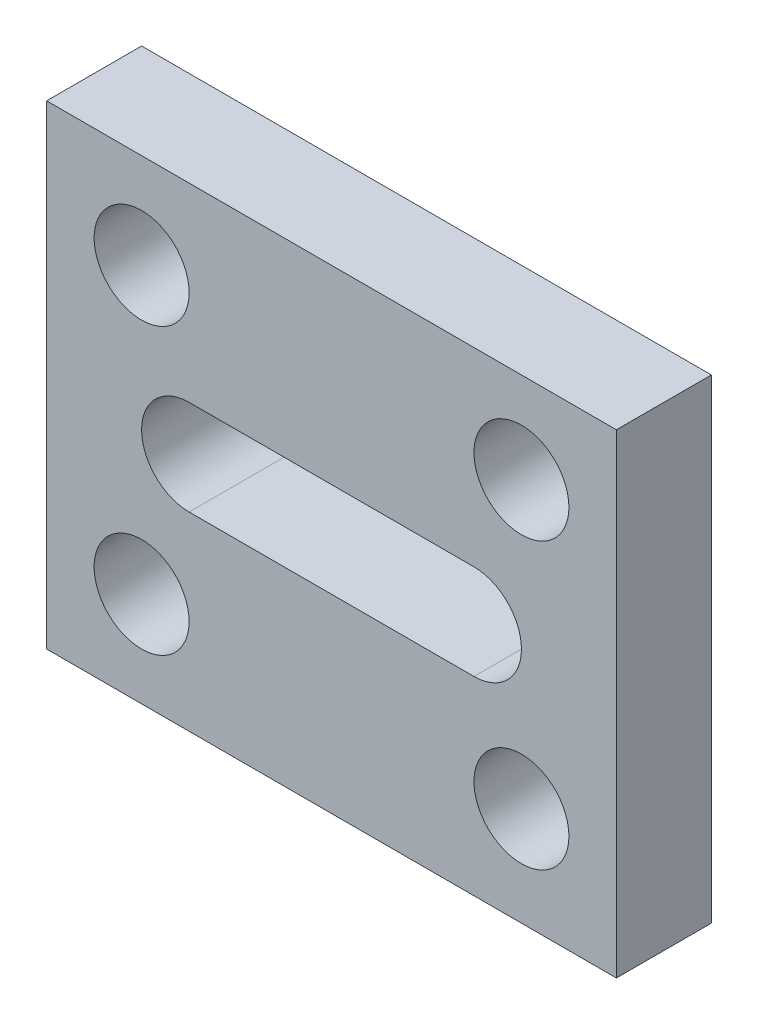
ISO-10303-21;
HEADER;
FILE_DESCRIPTION(('STEP AP214'),'2;1');
FILE_NAME('part.step','',(''),(''),'','','');
FILE_SCHEMA(('AUTOMOTIVE_DESIGN { 1 0 10303 214 1 1 1 1 }'));
ENDSEC;
DATA;
#1=APPLICATION_CONTEXT('core data for automotive mechanical design processes');
#2=APPLICATION_PROTOCOL_DEFINITION('international standard','automotive_design',2000,#1);
#3=PRODUCT_CONTEXT('',#1,'mechanical');
#4=PRODUCT('Part','Part','',(#3));
#5=PRODUCT_RELATED_PRODUCT_CATEGORY('part','',(#4));
#6=PRODUCT_DEFINITION_FORMATION('','',#4);
#7=PRODUCT_DEFINITION_CONTEXT('part definition',#1,'design');
#8=PRODUCT_DEFINITION('design','',#6,#7);
#9=PRODUCT_DEFINITION_SHAPE('','',#8);
#10=(LENGTH_UNIT() NAMED_UNIT(*) SI_UNIT(.MILLI.,.METRE.));
#11=(NAMED_UNIT(*) PLANE_ANGLE_UNIT() SI_UNIT($,.RADIAN.));
#12=(NAMED_UNIT(*) SI_UNIT($,.STERADIAN.) SOLID_ANGLE_UNIT());
#13=UNCERTAINTY_MEASURE_WITH_UNIT(LENGTH_MEASURE(1.E-05),#10,'distance_accuracy_value','');
#14=(GEOMETRIC_REPRESENTATION_CONTEXT(3) GLOBAL_UNCERTAINTY_ASSIGNED_CONTEXT((#13)) GLOBAL_UNIT_ASSIGNED_CONTEXT((#10,
#11,#12)) REPRESENTATION_CONTEXT('',''));
#15=CARTESIAN_POINT('',(0.,0.,0.));
#16=DIRECTION('',(0.,0.,1.));
#17=DIRECTION('',(1.,0.,0.));
#18=AXIS2_PLACEMENT_3D('',#15,#16,#17);
#19=CARTESIAN_POINT('',(0.,0.,20.));
#20=DIRECTION('',(0.,0.,1.));
#21=DIRECTION('',(1.,0.,0.));
#22=AXIS2_PLACEMENT_3D('',#19,#20,#21);
#23=PLANE('',#22);
#24=CARTESIAN_POINT('',(40.,30.8502817083049,20.));
#25=DIRECTION('',(0.,0.,1.));
#26=DIRECTION('',(1.,0.,0.));
#27=AXIS2_PLACEMENT_3D('',#24,#25,#26);
#28=CIRCLE('',#27,10.);
#29=CARTESIAN_POINT('',(50.,30.8502817083049,20.));
#30=VERTEX_POINT('',#29);
#31=EDGE_CURVE('E245',#30,#30,#28,.T.);
#32=ORIENTED_EDGE('',*,*,#31,.F.);
#33=EDGE_LOOP('',(#32));
#34=FACE_BOUND('',#33,.T.);
#35=CARTESIAN_POINT('',(-40.,-30.,20.));
#36=DIRECTION('',(0.,0.,1.));
#37=DIRECTION('',(1.,0.,0.));
#38=AXIS2_PLACEMENT_3D('',#35,#36,#37);
#39=CIRCLE('',#38,10.);
#40=CARTESIAN_POINT('',(-30.,-30.,20.));
#41=VERTEX_POINT('',#40);
#42=EDGE_CURVE('E127',#41,#41,#39,.T.);
#43=ORIENTED_EDGE('',*,*,#42,.F.);
#44=EDGE_LOOP('',(#43));
#45=FACE_BOUND('',#44,.T.);
#46=DIRECTION('',(0.,-1.,0.));
#47=VECTOR('',#46,1.);
#48=CARTESIAN_POINT('',(-60.,-50.,20.));
#49=LINE('',#48,#47);
#50=CARTESIAN_POINT('',(-60.,50.,20.));
#51=VERTEX_POINT('',#50);
#52=CARTESIAN_POINT('',(-60.,-50.,20.));
#53=VERTEX_POINT('',#52);
#54=EDGE_CURVE('E137',#51,#53,#49,.T.);
#55=ORIENTED_EDGE('',*,*,#54,.T.);
#56=DIRECTION('',(1.,0.,0.));
#57=VECTOR('',#56,1.);
#58=CARTESIAN_POINT('',(60.,-50.,20.));
#59=LINE('',#58,#57);
#60=CARTESIAN_POINT('',(60.,-50.,20.));
#61=VERTEX_POINT('',#60);
#62=EDGE_CURVE('E140',#53,#61,#59,.T.);
#63=ORIENTED_EDGE('',*,*,#62,.T.);
#64=DIRECTION('',(0.,1.,0.));
#65=VECTOR('',#64,1.);
#66=CARTESIAN_POINT('',(60.,-50.,20.));
#67=LINE('',#66,#65);
#68=CARTESIAN_POINT('',(60.,50.,20.));
#69=VERTEX_POINT('',#68);
#70=EDGE_CURVE('E143',#61,#69,#67,.T.);
#71=ORIENTED_EDGE('',*,*,#70,.T.);
#72=DIRECTION('',(-1.,0.,0.));
#73=VECTOR('',#72,1.);
#74=CARTESIAN_POINT('',(60.,50.,20.));
#75=LINE('',#74,#73);
#76=EDGE_CURVE('E145',#69,#51,#75,.T.);
#77=ORIENTED_EDGE('',*,*,#76,.T.);
#78=EDGE_LOOP('',(#55,#63,#71,#77));
#79=FACE_BOUND('',#78,.T.);
#80=DIRECTION('',(1.,0.,0.));
#81=VECTOR('',#80,1.);
#82=CARTESIAN_POINT('',(30.,-10.,20.));
#83=LINE('',#82,#81);
#84=CARTESIAN_POINT('',(-30.,-10.,20.));
#85=VERTEX_POINT('',#84);
#86=CARTESIAN_POINT('',(30.,-10.,20.));
#87=VERTEX_POINT('',#86);
#88=EDGE_CURVE('E106',#85,#87,#83,.T.);
#89=ORIENTED_EDGE('',*,*,#88,.F.);
#90=CARTESIAN_POINT('',(-30.,0.,20.));
#91=DIRECTION('',(0.,0.,1.));
#92=DIRECTION('',(1.,0.,0.));
#93=AXIS2_PLACEMENT_3D('',#90,#91,#92);
#94=CIRCLE('',#93,10.);
#95=CARTESIAN_POINT('',(-30.,9.99999999999999,20.));
#96=VERTEX_POINT('',#95);
#97=EDGE_CURVE('E98',#96,#85,#94,.T.);
#98=ORIENTED_EDGE('',*,*,#97,.F.);
#99=DIRECTION('',(-1.,0.,0.));
#100=VECTOR('',#99,1.);
#101=CARTESIAN_POINT('',(29.9999999999999,10.,20.));
#102=LINE('',#101,#100);
#103=CARTESIAN_POINT('',(30.,10.,20.));
#104=VERTEX_POINT('',#103);
#105=EDGE_CURVE('E121',#104,#96,#102,.T.);
#106=ORIENTED_EDGE('',*,*,#105,.F.);
#107=CARTESIAN_POINT('',(30.,0.,20.));
#108=DIRECTION('',(0.,0.,1.));
#109=DIRECTION('',(1.,0.,0.));
#110=AXIS2_PLACEMENT_3D('',#107,#108,#109);
#111=CIRCLE('',#110,10.);
#112=EDGE_CURVE('E119',#87,#104,#111,.T.);
#113=ORIENTED_EDGE('',*,*,#112,.F.);
#114=EDGE_LOOP('',(#89,#98,#106,#113));
#115=FACE_BOUND('',#114,.T.);
#116=CARTESIAN_POINT('',(-40.,30.,20.));
#117=DIRECTION('',(0.,0.,1.));
#118=DIRECTION('',(1.,0.,0.));
#119=AXIS2_PLACEMENT_3D('',#116,#117,#118);
#120=CIRCLE('',#119,10.);
#121=CARTESIAN_POINT('',(-30.,30.,20.));
#122=VERTEX_POINT('',#121);
#123=EDGE_CURVE('E251',#122,#122,#120,.T.);
#124=ORIENTED_EDGE('',*,*,#123,.F.);
#125=EDGE_LOOP('',(#124));
#126=FACE_BOUND('',#125,.T.);
#127=CARTESIAN_POINT('',(40.,-29.1497182916951,20.));
#128=DIRECTION('',(0.,0.,1.));
#129=DIRECTION('',(1.,0.,0.));
#130=AXIS2_PLACEMENT_3D('',#127,#128,#129);
#131=CIRCLE('',#130,10.);
#132=CARTESIAN_POINT('',(50.,-29.1497182916951,20.));
#133=VERTEX_POINT('',#132);
#134=EDGE_CURVE('E236',#133,#133,#131,.T.);
#135=ORIENTED_EDGE('',*,*,#134,.F.);
#136=EDGE_LOOP('',(#135));
#137=FACE_BOUND('',#136,.T.);
#138=ADVANCED_FACE('F33',(#34,#45,#79,#115,#126,#137),#23,.T.);
#139=CARTESIAN_POINT('',(0.,0.,0.));
#140=DIRECTION('',(0.,0.,1.));
#141=DIRECTION('',(1.,0.,0.));
#142=AXIS2_PLACEMENT_3D('',#139,#140,#141);
#143=PLANE('',#142);
#144=DIRECTION('',(0.,-1.,0.));
#145=VECTOR('',#144,1.);
#146=CARTESIAN_POINT('',(-60.,-50.,0.));
#147=LINE('',#146,#145);
#148=CARTESIAN_POINT('',(-60.,50.,0.));
#149=VERTEX_POINT('',#148);
#150=CARTESIAN_POINT('',(-60.,-50.,0.));
#151=VERTEX_POINT('',#150);
#152=EDGE_CURVE('E114',#149,#151,#147,.T.);
#153=ORIENTED_EDGE('',*,*,#152,.F.);
#154=DIRECTION('',(-1.,0.,0.));
#155=VECTOR('',#154,1.);
#156=CARTESIAN_POINT('',(60.,50.,0.));
#157=LINE('',#156,#155);
#158=CARTESIAN_POINT('',(60.,50.,0.));
#159=VERTEX_POINT('',#158);
#160=EDGE_CURVE('E141',#159,#149,#157,.T.);
#161=ORIENTED_EDGE('',*,*,#160,.F.);
#162=DIRECTION('',(0.,1.,0.));
#163=VECTOR('',#162,1.);
#164=CARTESIAN_POINT('',(60.,-50.,0.));
#165=LINE('',#164,#163);
#166=CARTESIAN_POINT('',(60.,-50.,0.));
#167=VERTEX_POINT('',#166);
#168=EDGE_CURVE('E152',#167,#159,#165,.T.);
#169=ORIENTED_EDGE('',*,*,#168,.F.);
#170=DIRECTION('',(1.,0.,0.));
#171=VECTOR('',#170,1.);
#172=CARTESIAN_POINT('',(60.,-50.,0.));
#173=LINE('',#172,#171);
#174=EDGE_CURVE('E150',#151,#167,#173,.T.);
#175=ORIENTED_EDGE('',*,*,#174,.F.);
#176=EDGE_LOOP('',(#153,#161,#169,#175));
#177=FACE_BOUND('',#176,.T.);
#178=CARTESIAN_POINT('',(-30.,0.,0.));
#179=DIRECTION('',(0.,0.,1.));
#180=DIRECTION('',(1.,0.,0.));
#181=AXIS2_PLACEMENT_3D('',#178,#179,#180);
#182=CIRCLE('',#181,10.);
#183=CARTESIAN_POINT('',(-30.,9.99999999999999,0.));
#184=VERTEX_POINT('',#183);
#185=CARTESIAN_POINT('',(-30.,-10.,0.));
#186=VERTEX_POINT('',#185);
#187=EDGE_CURVE('E56',#184,#186,#182,.T.);
#188=ORIENTED_EDGE('',*,*,#187,.T.);
#189=DIRECTION('',(1.,0.,0.));
#190=VECTOR('',#189,1.);
#191=CARTESIAN_POINT('',(30.,-10.,0.));
#192=LINE('',#191,#190);
#193=CARTESIAN_POINT('',(30.,-10.,0.));
#194=VERTEX_POINT('',#193);
#195=EDGE_CURVE('E113',#186,#194,#192,.T.);
#196=ORIENTED_EDGE('',*,*,#195,.T.);
#197=CARTESIAN_POINT('',(30.,0.,0.));
#198=DIRECTION('',(0.,0.,1.));
#199=DIRECTION('',(1.,0.,0.));
#200=AXIS2_PLACEMENT_3D('',#197,#198,#199);
#201=CIRCLE('',#200,10.);
#202=CARTESIAN_POINT('',(29.9999999999999,10.,0.));
#203=VERTEX_POINT('',#202);
#204=EDGE_CURVE('E129',#194,#203,#201,.T.);
#205=ORIENTED_EDGE('',*,*,#204,.T.);
#206=DIRECTION('',(-1.,0.,0.));
#207=VECTOR('',#206,1.);
#208=CARTESIAN_POINT('',(29.9999999999999,10.,0.));
#209=LINE('',#208,#207);
#210=EDGE_CURVE('E107',#203,#184,#209,.T.);
#211=ORIENTED_EDGE('',*,*,#210,.T.);
#212=EDGE_LOOP('',(#188,#196,#205,#211));
#213=FACE_BOUND('',#212,.T.);
#214=CARTESIAN_POINT('',(-40.,-30.,0.));
#215=DIRECTION('',(0.,0.,1.));
#216=DIRECTION('',(1.,0.,0.));
#217=AXIS2_PLACEMENT_3D('',#214,#215,#216);
#218=CIRCLE('',#217,10.);
#219=CARTESIAN_POINT('',(-30.,-30.,0.));
#220=VERTEX_POINT('',#219);
#221=EDGE_CURVE('E254',#220,#220,#218,.T.);
#222=ORIENTED_EDGE('',*,*,#221,.T.);
#223=EDGE_LOOP('',(#222));
#224=FACE_BOUND('',#223,.T.);
#225=CARTESIAN_POINT('',(-40.,30.,0.));
#226=DIRECTION('',(0.,0.,1.));
#227=DIRECTION('',(1.,0.,0.));
#228=AXIS2_PLACEMENT_3D('',#225,#226,#227);
#229=CIRCLE('',#228,10.);
#230=CARTESIAN_POINT('',(-30.,30.,0.));
#231=VERTEX_POINT('',#230);
#232=EDGE_CURVE('E248',#231,#231,#229,.T.);
#233=ORIENTED_EDGE('',*,*,#232,.T.);
#234=EDGE_LOOP('',(#233));
#235=FACE_BOUND('',#234,.T.);
#236=CARTESIAN_POINT('',(40.,30.8502817083049,0.));
#237=DIRECTION('',(0.,0.,1.));
#238=DIRECTION('',(1.,0.,0.));
#239=AXIS2_PLACEMENT_3D('',#236,#237,#238);
#240=CIRCLE('',#239,10.);
#241=CARTESIAN_POINT('',(50.,30.8502817083049,0.));
#242=VERTEX_POINT('',#241);
#243=EDGE_CURVE('E242',#242,#242,#240,.T.);
#244=ORIENTED_EDGE('',*,*,#243,.T.);
#245=EDGE_LOOP('',(#244));
#246=FACE_BOUND('',#245,.T.);
#247=CARTESIAN_POINT('',(40.,-29.1497182916951,0.));
#248=DIRECTION('',(0.,0.,1.));
#249=DIRECTION('',(1.,0.,0.));
#250=AXIS2_PLACEMENT_3D('',#247,#248,#249);
#251=CIRCLE('',#250,10.);
#252=CARTESIAN_POINT('',(50.,-29.1497182916951,0.));
#253=VERTEX_POINT('',#252);
#254=EDGE_CURVE('E239',#253,#253,#251,.T.);
#255=ORIENTED_EDGE('',*,*,#254,.T.);
#256=EDGE_LOOP('',(#255));
#257=FACE_BOUND('',#256,.T.);
#258=ADVANCED_FACE('F170',(#177,#213,#224,#235,#246,#257),#143,.F.);
#259=CARTESIAN_POINT('',(-60.,-50.,20.));
#260=DIRECTION('',(1.,0.,0.));
#261=DIRECTION('',(0.,0.,-1.));
#262=AXIS2_PLACEMENT_3D('',#259,#260,#261);
#263=PLANE('',#262);
#264=ORIENTED_EDGE('',*,*,#152,.T.);
#265=DIRECTION('',(0.,0.,-1.));
#266=VECTOR('',#265,1.);
#267=CARTESIAN_POINT('',(-60.,-50.,20.));
#268=LINE('',#267,#266);
#269=EDGE_CURVE('E11',#53,#151,#268,.T.);
#270=ORIENTED_EDGE('',*,*,#269,.F.);
#271=ORIENTED_EDGE('',*,*,#54,.F.);
#272=DIRECTION('',(0.,0.,-1.));
#273=VECTOR('',#272,1.);
#274=CARTESIAN_POINT('',(-60.,50.,20.));
#275=LINE('',#274,#273);
#276=EDGE_CURVE('E147',#51,#149,#275,.T.);
#277=ORIENTED_EDGE('',*,*,#276,.T.);
#278=EDGE_LOOP('',(#264,#270,#271,#277));
#279=FACE_BOUND('',#278,.T.);
#280=ADVANCED_FACE('F35',(#279),#263,.F.);
#281=CARTESIAN_POINT('',(60.,-50.,20.));
#282=DIRECTION('',(0.,1.,0.));
#283=DIRECTION('',(-1.,0.,0.));
#284=AXIS2_PLACEMENT_3D('',#281,#282,#283);
#285=PLANE('',#284);
#286=ORIENTED_EDGE('',*,*,#174,.T.);
#287=DIRECTION('',(0.,0.,-1.));
#288=VECTOR('',#287,1.);
#289=CARTESIAN_POINT('',(60.,-50.,20.));
#290=LINE('',#289,#288);
#291=EDGE_CURVE('E41',#61,#167,#290,.T.);
#292=ORIENTED_EDGE('',*,*,#291,.F.);
#293=ORIENTED_EDGE('',*,*,#62,.F.);
#294=ORIENTED_EDGE('',*,*,#269,.T.);
#295=EDGE_LOOP('',(#286,#292,#293,#294));
#296=FACE_BOUND('',#295,.T.);
#297=ADVANCED_FACE('F180',(#296),#285,.F.);
#298=CARTESIAN_POINT('',(60.,-50.,20.));
#299=DIRECTION('',(-1.,0.,0.));
#300=DIRECTION('',(0.,0.,1.));
#301=AXIS2_PLACEMENT_3D('',#298,#299,#300);
#302=PLANE('',#301);
#303=ORIENTED_EDGE('',*,*,#168,.T.);
#304=DIRECTION('',(0.,0.,-1.));
#305=VECTOR('',#304,1.);
#306=CARTESIAN_POINT('',(60.,50.,20.));
#307=LINE('',#306,#305);
#308=EDGE_CURVE('E157',#69,#159,#307,.T.);
#309=ORIENTED_EDGE('',*,*,#308,.F.);
#310=ORIENTED_EDGE('',*,*,#70,.F.);
#311=ORIENTED_EDGE('',*,*,#291,.T.);
#312=EDGE_LOOP('',(#303,#309,#310,#311));
#313=FACE_BOUND('',#312,.T.);
#314=ADVANCED_FACE('F164',(#313),#302,.F.);
#315=CARTESIAN_POINT('',(60.,50.,20.));
#316=DIRECTION('',(0.,-1.,0.));
#317=DIRECTION('',(1.,0.,0.));
#318=AXIS2_PLACEMENT_3D('',#315,#316,#317);
#319=PLANE('',#318);
#320=ORIENTED_EDGE('',*,*,#160,.T.);
#321=ORIENTED_EDGE('',*,*,#276,.F.);
#322=ORIENTED_EDGE('',*,*,#76,.F.);
#323=ORIENTED_EDGE('',*,*,#308,.T.);
#324=EDGE_LOOP('',(#320,#321,#322,#323));
#325=FACE_BOUND('',#324,.T.);
#326=ADVANCED_FACE('F174',(#325),#319,.F.);
#327=CARTESIAN_POINT('',(-30.,0.,20.));
#328=DIRECTION('',(0.,0.,-1.));
#329=DIRECTION('',(-1.,0.,0.));
#330=AXIS2_PLACEMENT_3D('',#327,#328,#329);
#331=CYLINDRICAL_SURFACE('',#330,10.);
#332=ORIENTED_EDGE('',*,*,#187,.F.);
#333=DIRECTION('',(0.,0.,-1.));
#334=VECTOR('',#333,1.);
#335=CARTESIAN_POINT('',(-30.,9.99999999999999,20.));
#336=LINE('',#335,#334);
#337=EDGE_CURVE('E102',#96,#184,#336,.T.);
#338=ORIENTED_EDGE('',*,*,#337,.F.);
#339=ORIENTED_EDGE('',*,*,#97,.T.);
#340=DIRECTION('',(0.,0.,-1.));
#341=VECTOR('',#340,1.);
#342=CARTESIAN_POINT('',(-30.,-10.,20.));
#343=LINE('',#342,#341);
#344=EDGE_CURVE('E101',#85,#186,#343,.T.);
#345=ORIENTED_EDGE('',*,*,#344,.T.);
#346=EDGE_LOOP('',(#332,#338,#339,#345));
#347=FACE_BOUND('',#346,.T.);
#348=ADVANCED_FACE('F100',(#347),#331,.F.);
#349=CARTESIAN_POINT('',(30.,-10.,20.));
#350=DIRECTION('',(0.,1.,0.));
#351=DIRECTION('',(-1.,0.,0.));
#352=AXIS2_PLACEMENT_3D('',#349,#350,#351);
#353=PLANE('',#352);
#354=ORIENTED_EDGE('',*,*,#195,.F.);
#355=ORIENTED_EDGE('',*,*,#344,.F.);
#356=ORIENTED_EDGE('',*,*,#88,.T.);
#357=DIRECTION('',(0.,0.,-1.));
#358=VECTOR('',#357,1.);
#359=CARTESIAN_POINT('',(30.,-10.,20.));
#360=LINE('',#359,#358);
#361=EDGE_CURVE('E115',#87,#194,#360,.T.);
#362=ORIENTED_EDGE('',*,*,#361,.T.);
#363=EDGE_LOOP('',(#354,#355,#356,#362));
#364=FACE_BOUND('',#363,.T.);
#365=ADVANCED_FACE('F110',(#364),#353,.T.);
#366=CARTESIAN_POINT('',(30.,0.,20.));
#367=DIRECTION('',(0.,0.,-1.));
#368=DIRECTION('',(-1.,0.,0.));
#369=AXIS2_PLACEMENT_3D('',#366,#367,#368);
#370=CYLINDRICAL_SURFACE('',#369,10.);
#371=ORIENTED_EDGE('',*,*,#204,.F.);
#372=ORIENTED_EDGE('',*,*,#361,.F.);
#373=ORIENTED_EDGE('',*,*,#112,.T.);
#374=DIRECTION('',(0.,0.,-1.));
#375=VECTOR('',#374,1.);
#376=CARTESIAN_POINT('',(29.9999999999999,10.,20.));
#377=LINE('',#376,#375);
#378=EDGE_CURVE('E48',#104,#203,#377,.T.);
#379=ORIENTED_EDGE('',*,*,#378,.T.);
#380=EDGE_LOOP('',(#371,#372,#373,#379));
#381=FACE_BOUND('',#380,.T.);
#382=ADVANCED_FACE('F206',(#381),#370,.F.);
#383=CARTESIAN_POINT('',(29.9999999999999,10.,20.));
#384=DIRECTION('',(0.,-1.,0.));
#385=DIRECTION('',(1.,0.,0.));
#386=AXIS2_PLACEMENT_3D('',#383,#384,#385);
#387=PLANE('',#386);
#388=ORIENTED_EDGE('',*,*,#210,.F.);
#389=ORIENTED_EDGE('',*,*,#378,.F.);
#390=ORIENTED_EDGE('',*,*,#105,.T.);
#391=ORIENTED_EDGE('',*,*,#337,.T.);
#392=EDGE_LOOP('',(#388,#389,#390,#391));
#393=FACE_BOUND('',#392,.T.);
#394=ADVANCED_FACE('F210',(#393),#387,.T.);
#395=CARTESIAN_POINT('',(-40.,-30.,20.));
#396=DIRECTION('',(0.,0.,-1.));
#397=DIRECTION('',(-1.,0.,0.));
#398=AXIS2_PLACEMENT_3D('',#395,#396,#397);
#399=CYLINDRICAL_SURFACE('',#398,10.);
#400=ORIENTED_EDGE('',*,*,#42,.T.);
#401=EDGE_LOOP('',(#400));
#402=FACE_BOUND('',#401,.T.);
#403=ORIENTED_EDGE('',*,*,#221,.F.);
#404=EDGE_LOOP('',(#403));
#405=FACE_BOUND('',#404,.T.);
#406=ADVANCED_FACE('F216',(#402,#405),#399,.F.);
#407=CARTESIAN_POINT('',(-40.,30.,20.));
#408=DIRECTION('',(0.,0.,-1.));
#409=DIRECTION('',(-1.,0.,0.));
#410=AXIS2_PLACEMENT_3D('',#407,#408,#409);
#411=CYLINDRICAL_SURFACE('',#410,10.);
#412=ORIENTED_EDGE('',*,*,#123,.T.);
#413=EDGE_LOOP('',(#412));
#414=FACE_BOUND('',#413,.T.);
#415=ORIENTED_EDGE('',*,*,#232,.F.);
#416=EDGE_LOOP('',(#415));
#417=FACE_BOUND('',#416,.T.);
#418=ADVANCED_FACE('F219',(#414,#417),#411,.F.);
#419=CARTESIAN_POINT('',(40.,30.8502817083049,20.));
#420=DIRECTION('',(0.,0.,-1.));
#421=DIRECTION('',(-1.,0.,0.));
#422=AXIS2_PLACEMENT_3D('',#419,#420,#421);
#423=CYLINDRICAL_SURFACE('',#422,10.);
#424=ORIENTED_EDGE('',*,*,#31,.T.);
#425=EDGE_LOOP('',(#424));
#426=FACE_BOUND('',#425,.T.);
#427=ORIENTED_EDGE('',*,*,#243,.F.);
#428=EDGE_LOOP('',(#427));
#429=FACE_BOUND('',#428,.T.);
#430=ADVANCED_FACE('F223',(#426,#429),#423,.F.);
#431=CARTESIAN_POINT('',(40.,-29.1497182916951,20.));
#432=DIRECTION('',(0.,0.,-1.));
#433=DIRECTION('',(-1.,0.,0.));
#434=AXIS2_PLACEMENT_3D('',#431,#432,#433);
#435=CYLINDRICAL_SURFACE('',#434,10.);
#436=ORIENTED_EDGE('',*,*,#134,.T.);
#437=EDGE_LOOP('',(#436));
#438=FACE_BOUND('',#437,.T.);
#439=ORIENTED_EDGE('',*,*,#254,.F.);
#440=EDGE_LOOP('',(#439));
#441=FACE_BOUND('',#440,.T.);
#442=ADVANCED_FACE('F227',(#438,#441),#435,.F.);
#443=CLOSED_SHELL('',(#138,#258,#280,#297,#314,#326,#348,#365,#382,#394,#406,#418,#430,#442));
#444=MANIFOLD_SOLID_BREP('B2',#443);
#445=ADVANCED_BREP_SHAPE_REPRESENTATION('',(#18,#444),#14);
#446=SHAPE_DEFINITION_REPRESENTATION(#9,#445);
ENDSEC;
END-ISO-10303-21;
